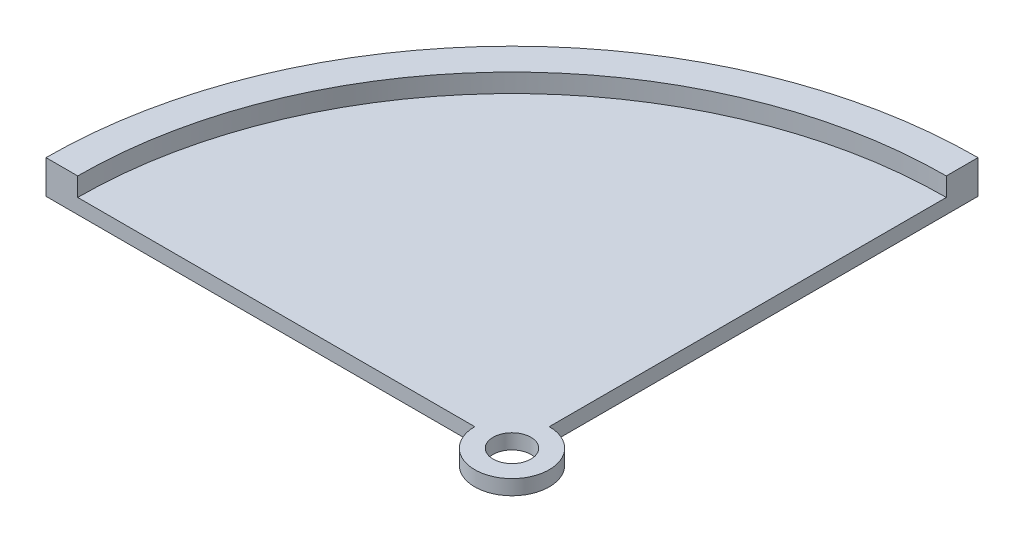
ISO-10303-21;
HEADER;
FILE_DESCRIPTION(('STEP AP214'),'2;1');
FILE_NAME('part.step','',(''),(''),'','','');
FILE_SCHEMA(('AUTOMOTIVE_DESIGN { 1 0 10303 214 1 1 1 1 }'));
ENDSEC;
DATA;
#1=APPLICATION_CONTEXT('core data for automotive mechanical design processes');
#2=APPLICATION_PROTOCOL_DEFINITION('international standard','automotive_design',2000,#1);
#3=PRODUCT_CONTEXT('',#1,'mechanical');
#4=PRODUCT('Part','Part','',(#3));
#5=PRODUCT_RELATED_PRODUCT_CATEGORY('part','',(#4));
#6=PRODUCT_DEFINITION_FORMATION('','',#4);
#7=PRODUCT_DEFINITION_CONTEXT('part definition',#1,'design');
#8=PRODUCT_DEFINITION('design','',#6,#7);
#9=PRODUCT_DEFINITION_SHAPE('','',#8);
#10=(LENGTH_UNIT() NAMED_UNIT(*) SI_UNIT(.MILLI.,.METRE.));
#11=(NAMED_UNIT(*) PLANE_ANGLE_UNIT() SI_UNIT($,.RADIAN.));
#12=(NAMED_UNIT(*) SI_UNIT($,.STERADIAN.) SOLID_ANGLE_UNIT());
#13=UNCERTAINTY_MEASURE_WITH_UNIT(LENGTH_MEASURE(1.E-05),#10,'distance_accuracy_value','');
#14=(GEOMETRIC_REPRESENTATION_CONTEXT(3) GLOBAL_UNCERTAINTY_ASSIGNED_CONTEXT((#13)) GLOBAL_UNIT_ASSIGNED_CONTEXT((#10,
#11,#12)) REPRESENTATION_CONTEXT('',''));
#15=CARTESIAN_POINT('',(0.,0.,0.));
#16=DIRECTION('',(0.,0.,1.));
#17=DIRECTION('',(1.,0.,0.));
#18=AXIS2_PLACEMENT_3D('',#15,#16,#17);
#19=CARTESIAN_POINT('',(0.,4.,0.));
#20=DIRECTION('',(0.,1.,0.));
#21=DIRECTION('',(0.,0.,1.));
#22=AXIS2_PLACEMENT_3D('',#19,#20,#21);
#23=PLANE('',#22);
#24=CARTESIAN_POINT('',(62.5,4.,62.5));
#25=DIRECTION('',(0.,1.,0.));
#26=DIRECTION('',(0.,0.,1.));
#27=AXIS2_PLACEMENT_3D('',#24,#25,#26);
#28=CIRCLE('',#27,5.075);
#29=CARTESIAN_POINT('',(62.5,4.,67.575));
#30=VERTEX_POINT('',#29);
#31=EDGE_CURVE('E283',#30,#30,#28,.T.);
#32=ORIENTED_EDGE('',*,*,#31,.F.);
#33=EDGE_LOOP('',(#32));
#34=FACE_BOUND('',#33,.T.);
#35=DIRECTION('',(1.,0.,0.));
#36=VECTOR('',#35,1.);
#37=CARTESIAN_POINT('',(-62.5,4.,62.5));
#38=LINE('',#37,#36);
#39=CARTESIAN_POINT('',(-54.,4.,62.5));
#40=VERTEX_POINT('',#39);
#41=CARTESIAN_POINT('',(52.5,4.,62.5));
#42=VERTEX_POINT('',#41);
#43=EDGE_CURVE('E120',#40,#42,#38,.T.);
#44=ORIENTED_EDGE('',*,*,#43,.T.);
#45=CARTESIAN_POINT('',(62.5,4.,62.5));
#46=DIRECTION('',(0.,1.,0.));
#47=DIRECTION('',(0.,0.,1.));
#48=AXIS2_PLACEMENT_3D('',#45,#46,#47);
#49=CIRCLE('',#48,9.99999999999998);
#50=CARTESIAN_POINT('',(62.5,4.,52.5));
#51=VERTEX_POINT('',#50);
#52=EDGE_CURVE('E159',#42,#51,#49,.T.);
#53=ORIENTED_EDGE('',*,*,#52,.T.);
#54=DIRECTION('',(0.,0.,-1.));
#55=VECTOR('',#54,1.);
#56=CARTESIAN_POINT('',(62.5,4.,-62.5));
#57=LINE('',#56,#55);
#58=CARTESIAN_POINT('',(62.5,4.,-54.));
#59=VERTEX_POINT('',#58);
#60=EDGE_CURVE('E59',#51,#59,#57,.T.);
#61=ORIENTED_EDGE('',*,*,#60,.T.);
#62=CARTESIAN_POINT('',(62.5,4.,62.5));
#63=DIRECTION('',(0.,-1.,0.));
#64=DIRECTION('',(0.,0.,-1.));
#65=AXIS2_PLACEMENT_3D('',#62,#63,#64);
#66=CIRCLE('',#65,116.5);
#67=EDGE_CURVE('E117',#40,#59,#66,.T.);
#68=ORIENTED_EDGE('',*,*,#67,.F.);
#69=EDGE_LOOP('',(#44,#53,#61,#68));
#70=FACE_BOUND('',#69,.T.);
#71=ADVANCED_FACE('F43',(#34,#70),#23,.T.);
#72=CARTESIAN_POINT('',(62.5,4.,-62.5));
#73=DIRECTION('',(-1.,0.,0.));
#74=DIRECTION('',(0.,0.,1.));
#75=AXIS2_PLACEMENT_3D('',#72,#73,#74);
#76=PLANE('',#75);
#77=ORIENTED_EDGE('',*,*,#60,.F.);
#78=DIRECTION('',(0.,1.,0.));
#79=VECTOR('',#78,1.);
#80=CARTESIAN_POINT('',(62.5,-28.2842712474618,52.5));
#81=LINE('',#80,#79);
#82=CARTESIAN_POINT('',(62.5,0.,52.5));
#83=VERTEX_POINT('',#82);
#84=EDGE_CURVE('E153',#51,#83,#81,.F.);
#85=ORIENTED_EDGE('',*,*,#84,.T.);
#86=DIRECTION('',(0.,0.,-1.));
#87=VECTOR('',#86,1.);
#88=CARTESIAN_POINT('',(62.5,0.,-62.5));
#89=LINE('',#88,#87);
#90=CARTESIAN_POINT('',(62.5,0.,-62.5));
#91=VERTEX_POINT('',#90);
#92=EDGE_CURVE('E122',#83,#91,#89,.T.);
#93=ORIENTED_EDGE('',*,*,#92,.T.);
#94=DIRECTION('',(0.,-1.,0.));
#95=VECTOR('',#94,1.);
#96=CARTESIAN_POINT('',(62.5,4.,-62.5));
#97=LINE('',#96,#95);
#98=CARTESIAN_POINT('',(62.5,9.,-62.5));
#99=VERTEX_POINT('',#98);
#100=EDGE_CURVE('E141',#99,#91,#97,.T.);
#101=ORIENTED_EDGE('',*,*,#100,.F.);
#102=DIRECTION('',(0.,0.,-1.));
#103=VECTOR('',#102,1.);
#104=CARTESIAN_POINT('',(62.5,9.,-62.5));
#105=LINE('',#104,#103);
#106=CARTESIAN_POINT('',(62.5,9.,-54.));
#107=VERTEX_POINT('',#106);
#108=EDGE_CURVE('E108',#107,#99,#105,.T.);
#109=ORIENTED_EDGE('',*,*,#108,.F.);
#110=DIRECTION('',(0.,-1.,0.));
#111=VECTOR('',#110,1.);
#112=CARTESIAN_POINT('',(62.5,9.,-54.));
#113=LINE('',#112,#111);
#114=EDGE_CURVE('E103',#107,#59,#113,.T.);
#115=ORIENTED_EDGE('',*,*,#114,.T.);
#116=EDGE_LOOP('',(#77,#85,#93,#101,#109,#115));
#117=FACE_BOUND('',#116,.T.);
#118=ADVANCED_FACE('F152',(#117),#76,.F.);
#119=CARTESIAN_POINT('',(-62.5,4.,62.5));
#120=DIRECTION('',(0.,0.,-1.));
#121=DIRECTION('',(-1.,0.,0.));
#122=AXIS2_PLACEMENT_3D('',#119,#120,#121);
#123=PLANE('',#122);
#124=DIRECTION('',(1.,0.,0.));
#125=VECTOR('',#124,1.);
#126=CARTESIAN_POINT('',(-62.5,0.,62.5));
#127=LINE('',#126,#125);
#128=CARTESIAN_POINT('',(-62.5,0.,62.5));
#129=VERTEX_POINT('',#128);
#130=CARTESIAN_POINT('',(52.5,0.,62.5));
#131=VERTEX_POINT('',#130);
#132=EDGE_CURVE('E127',#129,#131,#127,.T.);
#133=ORIENTED_EDGE('',*,*,#132,.T.);
#134=DIRECTION('',(0.,1.,0.));
#135=VECTOR('',#134,1.);
#136=CARTESIAN_POINT('',(52.5,-28.2842712474618,62.5));
#137=LINE('',#136,#135);
#138=EDGE_CURVE('E67',#131,#42,#137,.T.);
#139=ORIENTED_EDGE('',*,*,#138,.T.);
#140=ORIENTED_EDGE('',*,*,#43,.F.);
#141=DIRECTION('',(0.,-1.,0.));
#142=VECTOR('',#141,1.);
#143=CARTESIAN_POINT('',(-54.,9.,62.5));
#144=LINE('',#143,#142);
#145=CARTESIAN_POINT('',(-54.,9.,62.5));
#146=VERTEX_POINT('',#145);
#147=EDGE_CURVE('E102',#146,#40,#144,.T.);
#148=ORIENTED_EDGE('',*,*,#147,.F.);
#149=DIRECTION('',(1.,0.,0.));
#150=VECTOR('',#149,1.);
#151=CARTESIAN_POINT('',(-62.5,9.,62.5));
#152=LINE('',#151,#150);
#153=CARTESIAN_POINT('',(-62.5,9.,62.5));
#154=VERTEX_POINT('',#153);
#155=EDGE_CURVE('E109',#154,#146,#152,.T.);
#156=ORIENTED_EDGE('',*,*,#155,.F.);
#157=DIRECTION('',(0.,-1.,0.));
#158=VECTOR('',#157,1.);
#159=CARTESIAN_POINT('',(-62.5,4.,62.5));
#160=LINE('',#159,#158);
#161=EDGE_CURVE('E135',#154,#129,#160,.T.);
#162=ORIENTED_EDGE('',*,*,#161,.T.);
#163=EDGE_LOOP('',(#133,#139,#140,#148,#156,#162));
#164=FACE_BOUND('',#163,.T.);
#165=ADVANCED_FACE('F119',(#164),#123,.F.);
#166=CARTESIAN_POINT('',(0.,0.,0.));
#167=DIRECTION('',(0.,1.,0.));
#168=DIRECTION('',(0.,0.,1.));
#169=AXIS2_PLACEMENT_3D('',#166,#167,#168);
#170=PLANE('',#169);
#171=CARTESIAN_POINT('',(62.5,0.,62.5));
#172=DIRECTION('',(0.,1.,0.));
#173=DIRECTION('',(0.,0.,1.));
#174=AXIS2_PLACEMENT_3D('',#171,#172,#173);
#175=CIRCLE('',#174,5.075);
#176=CARTESIAN_POINT('',(62.5,0.,67.575));
#177=VERTEX_POINT('',#176);
#178=EDGE_CURVE('E165',#177,#177,#175,.F.);
#179=ORIENTED_EDGE('',*,*,#178,.F.);
#180=EDGE_LOOP('',(#179));
#181=FACE_BOUND('',#180,.T.);
#182=ORIENTED_EDGE('',*,*,#132,.F.);
#183=CARTESIAN_POINT('',(62.5,0.,62.5));
#184=DIRECTION('',(0.,1.,0.));
#185=DIRECTION('',(0.,0.,1.));
#186=AXIS2_PLACEMENT_3D('',#183,#184,#185);
#187=CIRCLE('',#186,125.);
#188=EDGE_CURVE('E52',#129,#91,#187,.F.);
#189=ORIENTED_EDGE('',*,*,#188,.T.);
#190=ORIENTED_EDGE('',*,*,#92,.F.);
#191=CARTESIAN_POINT('',(62.5,0.,62.5));
#192=DIRECTION('',(0.,1.,0.));
#193=DIRECTION('',(0.,0.,1.));
#194=AXIS2_PLACEMENT_3D('',#191,#192,#193);
#195=CIRCLE('',#194,9.99999999999998);
#196=EDGE_CURVE('E157',#83,#131,#195,.F.);
#197=ORIENTED_EDGE('',*,*,#196,.T.);
#198=EDGE_LOOP('',(#182,#189,#190,#197));
#199=FACE_BOUND('',#198,.T.);
#200=ADVANCED_FACE('F148',(#181,#199),#170,.F.);
#201=CARTESIAN_POINT('',(62.5,9.,62.5));
#202=DIRECTION('',(0.,-1.,0.));
#203=DIRECTION('',(0.,0.,-1.));
#204=AXIS2_PLACEMENT_3D('',#201,#202,#203);
#205=CYLINDRICAL_SURFACE('',#204,116.5);
#206=ORIENTED_EDGE('',*,*,#67,.T.);
#207=ORIENTED_EDGE('',*,*,#114,.F.);
#208=CARTESIAN_POINT('',(62.5,9.,62.5));
#209=DIRECTION('',(0.,-1.,0.));
#210=DIRECTION('',(0.,0.,-1.));
#211=AXIS2_PLACEMENT_3D('',#208,#209,#210);
#212=CIRCLE('',#211,116.5);
#213=EDGE_CURVE('E97',#146,#107,#212,.T.);
#214=ORIENTED_EDGE('',*,*,#213,.F.);
#215=ORIENTED_EDGE('',*,*,#147,.T.);
#216=EDGE_LOOP('',(#206,#207,#214,#215));
#217=FACE_BOUND('',#216,.T.);
#218=ADVANCED_FACE('F100',(#217),#205,.F.);
#219=CARTESIAN_POINT('',(62.5,9.,62.5));
#220=DIRECTION('',(0.,-1.,0.));
#221=DIRECTION('',(0.,0.,-1.));
#222=AXIS2_PLACEMENT_3D('',#219,#220,#221);
#223=PLANE('',#222);
#224=ORIENTED_EDGE('',*,*,#108,.T.);
#225=CARTESIAN_POINT('',(62.5,9.,62.5));
#226=DIRECTION('',(0.,-1.,0.));
#227=DIRECTION('',(0.,0.,-1.));
#228=AXIS2_PLACEMENT_3D('',#225,#226,#227);
#229=CIRCLE('',#228,125.);
#230=EDGE_CURVE('E11',#99,#154,#229,.F.);
#231=ORIENTED_EDGE('',*,*,#230,.T.);
#232=ORIENTED_EDGE('',*,*,#155,.T.);
#233=ORIENTED_EDGE('',*,*,#213,.T.);
#234=EDGE_LOOP('',(#224,#231,#232,#233));
#235=FACE_BOUND('',#234,.T.);
#236=ADVANCED_FACE('F112',(#235),#223,.F.);
#237=CARTESIAN_POINT('',(62.5,-28.2842712474618,62.5));
#238=DIRECTION('',(0.,1.,0.));
#239=DIRECTION('',(0.,0.,1.));
#240=AXIS2_PLACEMENT_3D('',#237,#238,#239);
#241=CYLINDRICAL_SURFACE('',#240,9.99999999999998);
#242=ORIENTED_EDGE('',*,*,#84,.F.);
#243=ORIENTED_EDGE('',*,*,#52,.F.);
#244=ORIENTED_EDGE('',*,*,#138,.F.);
#245=ORIENTED_EDGE('',*,*,#196,.F.);
#246=EDGE_LOOP('',(#242,#243,#244,#245));
#247=FACE_BOUND('',#246,.T.);
#248=ADVANCED_FACE('F156',(#247),#241,.T.);
#249=CARTESIAN_POINT('',(62.5,-14.3542676580869,62.5));
#250=DIRECTION('',(0.,1.,0.));
#251=DIRECTION('',(0.,0.,1.));
#252=AXIS2_PLACEMENT_3D('',#249,#250,#251);
#253=CYLINDRICAL_SURFACE('',#252,5.075);
#254=ORIENTED_EDGE('',*,*,#178,.T.);
#255=EDGE_LOOP('',(#254));
#256=FACE_BOUND('',#255,.T.);
#257=ORIENTED_EDGE('',*,*,#31,.T.);
#258=EDGE_LOOP('',(#257));
#259=FACE_BOUND('',#258,.T.);
#260=ADVANCED_FACE('F213',(#256,#259),#253,.F.);
#261=CARTESIAN_POINT('',(62.5,4.,62.5));
#262=DIRECTION('',(0.,-1.,0.));
#263=DIRECTION('',(0.,0.,-1.));
#264=AXIS2_PLACEMENT_3D('',#261,#262,#263);
#265=CYLINDRICAL_SURFACE('',#264,125.);
#266=ORIENTED_EDGE('',*,*,#230,.F.);
#267=ORIENTED_EDGE('',*,*,#100,.T.);
#268=ORIENTED_EDGE('',*,*,#188,.F.);
#269=ORIENTED_EDGE('',*,*,#161,.F.);
#270=EDGE_LOOP('',(#266,#267,#268,#269));
#271=FACE_BOUND('',#270,.T.);
#272=ADVANCED_FACE('F45',(#271),#265,.T.);
#273=CLOSED_SHELL('',(#71,#118,#165,#200,#218,#236,#248,#260,#272));
#274=MANIFOLD_SOLID_BREP('B2',#273);
#275=ADVANCED_BREP_SHAPE_REPRESENTATION('',(#18,#274),#14);
#276=SHAPE_DEFINITION_REPRESENTATION(#9,#275);
ENDSEC;
END-ISO-10303-21;
